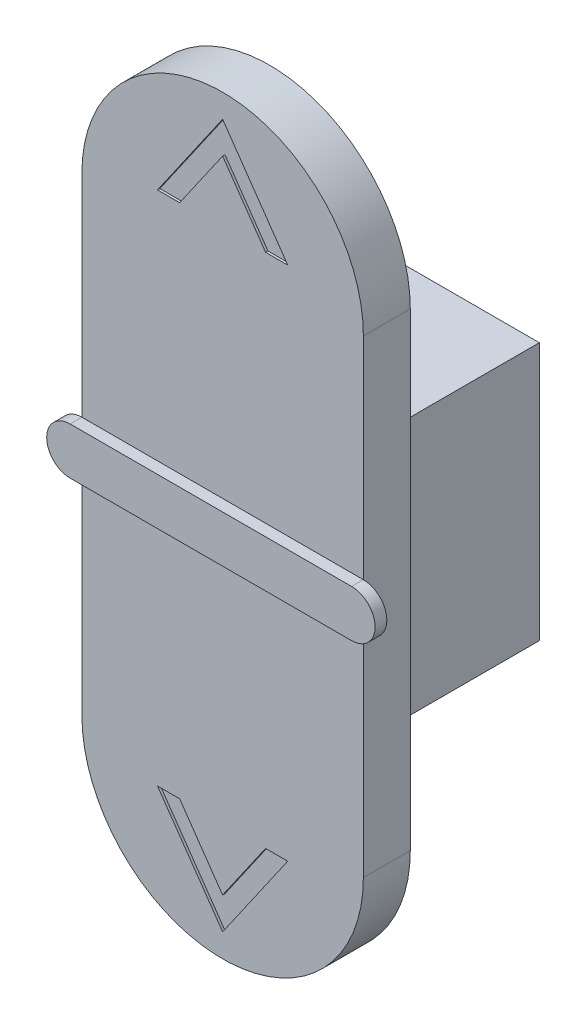
ISO-10303-21;
HEADER;
FILE_DESCRIPTION(('STEP AP214'),'2;1');
FILE_NAME('part.step','',(''),(''),'','','');
FILE_SCHEMA(('AUTOMOTIVE_DESIGN { 1 0 10303 214 1 1 1 1 }'));
ENDSEC;
DATA;
#1=APPLICATION_CONTEXT('core data for automotive mechanical design processes');
#2=APPLICATION_PROTOCOL_DEFINITION('international standard','automotive_design',2000,#1);
#3=PRODUCT_CONTEXT('',#1,'mechanical');
#4=PRODUCT('Part','Part','',(#3));
#5=PRODUCT_RELATED_PRODUCT_CATEGORY('part','',(#4));
#6=PRODUCT_DEFINITION_FORMATION('','',#4);
#7=PRODUCT_DEFINITION_CONTEXT('part definition',#1,'design');
#8=PRODUCT_DEFINITION('design','',#6,#7);
#9=PRODUCT_DEFINITION_SHAPE('','',#8);
#10=(LENGTH_UNIT() NAMED_UNIT(*) SI_UNIT(.MILLI.,.METRE.));
#11=(NAMED_UNIT(*) PLANE_ANGLE_UNIT() SI_UNIT($,.RADIAN.));
#12=(NAMED_UNIT(*) SI_UNIT($,.STERADIAN.) SOLID_ANGLE_UNIT());
#13=UNCERTAINTY_MEASURE_WITH_UNIT(LENGTH_MEASURE(1.E-05),#10,'distance_accuracy_value','');
#14=(GEOMETRIC_REPRESENTATION_CONTEXT(3) GLOBAL_UNCERTAINTY_ASSIGNED_CONTEXT((#13)) GLOBAL_UNIT_ASSIGNED_CONTEXT((#10,
#11,#12)) REPRESENTATION_CONTEXT('',''));
#15=CARTESIAN_POINT('',(0.,0.,0.));
#16=DIRECTION('',(0.,0.,1.));
#17=DIRECTION('',(1.,0.,0.));
#18=AXIS2_PLACEMENT_3D('',#15,#16,#17);
#19=CARTESIAN_POINT('',(0.,10.,0.));
#20=DIRECTION('',(0.,0.,1.));
#21=DIRECTION('',(1.,0.,0.));
#22=AXIS2_PLACEMENT_3D('',#19,#20,#21);
#23=PLANE('',#22);
#24=CARTESIAN_POINT('',(0.,10.,0.));
#25=DIRECTION('',(0.,0.,1.));
#26=DIRECTION('',(1.,0.,0.));
#27=AXIS2_PLACEMENT_3D('',#24,#25,#26);
#28=CIRCLE('',#27,6.);
#29=CARTESIAN_POINT('',(6.,10.,0.));
#30=VERTEX_POINT('',#29);
#31=CARTESIAN_POINT('',(-6.00000000000001,10.,0.));
#32=VERTEX_POINT('',#31);
#33=EDGE_CURVE('E518',#30,#32,#28,.T.);
#34=ORIENTED_EDGE('',*,*,#33,.F.);
#35=DIRECTION('',(0.,1.,0.));
#36=VECTOR('',#35,1.);
#37=CARTESIAN_POINT('',(6.,10.,0.));
#38=LINE('',#37,#36);
#39=CARTESIAN_POINT('',(6.,-10.,0.));
#40=VERTEX_POINT('',#39);
#41=EDGE_CURVE('E524',#40,#30,#38,.T.);
#42=ORIENTED_EDGE('',*,*,#41,.F.);
#43=CARTESIAN_POINT('',(0.,-10.,0.));
#44=DIRECTION('',(0.,0.,1.));
#45=DIRECTION('',(1.,0.,0.));
#46=AXIS2_PLACEMENT_3D('',#43,#44,#45);
#47=CIRCLE('',#46,6.);
#48=CARTESIAN_POINT('',(-6.,-10.,0.));
#49=VERTEX_POINT('',#48);
#50=EDGE_CURVE('E545',#49,#40,#47,.T.);
#51=ORIENTED_EDGE('',*,*,#50,.F.);
#52=DIRECTION('',(0.,-1.,0.));
#53=VECTOR('',#52,1.);
#54=CARTESIAN_POINT('',(-6.00000000000001,10.,0.));
#55=LINE('',#54,#53);
#56=EDGE_CURVE('E542',#32,#49,#55,.T.);
#57=ORIENTED_EDGE('',*,*,#56,.F.);
#58=EDGE_LOOP('',(#34,#42,#51,#57));
#59=FACE_BOUND('',#58,.T.);
#60=DIRECTION('',(0.,1.,0.));
#61=VECTOR('',#60,1.);
#62=CARTESIAN_POINT('',(-5.5,0.,0.));
#63=LINE('',#62,#61);
#64=CARTESIAN_POINT('',(-5.5,-5.5,0.));
#65=VERTEX_POINT('',#64);
#66=CARTESIAN_POINT('',(-5.5,5.5,0.));
#67=VERTEX_POINT('',#66);
#68=EDGE_CURVE('E268',#65,#67,#63,.T.);
#69=ORIENTED_EDGE('',*,*,#68,.F.);
#70=DIRECTION('',(-1.,0.,0.));
#71=VECTOR('',#70,1.);
#72=CARTESIAN_POINT('',(0.,-5.5,0.));
#73=LINE('',#72,#71);
#74=CARTESIAN_POINT('',(5.5,-5.5,0.));
#75=VERTEX_POINT('',#74);
#76=EDGE_CURVE('E307',#75,#65,#73,.T.);
#77=ORIENTED_EDGE('',*,*,#76,.F.);
#78=DIRECTION('',(0.,-1.,0.));
#79=VECTOR('',#78,1.);
#80=CARTESIAN_POINT('',(5.5,0.,0.));
#81=LINE('',#80,#79);
#82=CARTESIAN_POINT('',(5.5,5.5,0.));
#83=VERTEX_POINT('',#82);
#84=EDGE_CURVE('E84',#83,#75,#81,.T.);
#85=ORIENTED_EDGE('',*,*,#84,.F.);
#86=DIRECTION('',(1.,0.,0.));
#87=VECTOR('',#86,1.);
#88=CARTESIAN_POINT('',(0.,5.5,0.));
#89=LINE('',#88,#87);
#90=EDGE_CURVE('E79',#67,#83,#89,.T.);
#91=ORIENTED_EDGE('',*,*,#90,.F.);
#92=EDGE_LOOP('',(#69,#77,#85,#91));
#93=FACE_BOUND('',#92,.T.);
#94=ADVANCED_FACE('F63',(#59,#93),#23,.F.);
#95=CARTESIAN_POINT('',(0.,10.,2.));
#96=DIRECTION('',(0.,0.,1.));
#97=DIRECTION('',(1.,0.,0.));
#98=AXIS2_PLACEMENT_3D('',#95,#96,#97);
#99=PLANE('',#98);
#100=DIRECTION('',(-0.570395809495344,0.821369965673296,0.));
#101=VECTOR('',#100,1.);
#102=CARTESIAN_POINT('',(0.,15.,2.));
#103=LINE('',#102,#101);
#104=CARTESIAN_POINT('',(2.77560933298638,11.0031225604996,2.));
#105=VERTEX_POINT('',#104);
#106=CARTESIAN_POINT('',(0.,15.,2.));
#107=VERTEX_POINT('',#106);
#108=EDGE_CURVE('E368',#105,#107,#103,.T.);
#109=ORIENTED_EDGE('',*,*,#108,.F.);
#110=DIRECTION('',(1.,0.,0.));
#111=VECTOR('',#110,1.);
#112=CARTESIAN_POINT('',(2.77560933298638,11.0031225604996,2.));
#113=LINE('',#112,#111);
#114=CARTESIAN_POINT('',(1.83190215977101,11.0031225604996,2.));
#115=VERTEX_POINT('',#114);
#116=EDGE_CURVE('E347',#115,#105,#113,.T.);
#117=ORIENTED_EDGE('',*,*,#116,.F.);
#118=DIRECTION('',(0.570395809495344,-0.821369965673296,0.));
#119=VECTOR('',#118,1.);
#120=CARTESIAN_POINT('',(1.83190215977101,11.0031225604996,2.));
#121=LINE('',#120,#119);
#122=CARTESIAN_POINT('',(0.,13.6410616705699,2.));
#123=VERTEX_POINT('',#122);
#124=EDGE_CURVE('E384',#123,#115,#121,.T.);
#125=ORIENTED_EDGE('',*,*,#124,.F.);
#126=DIRECTION('',(0.570395809495344,0.821369965673296,0.));
#127=VECTOR('',#126,1.);
#128=CARTESIAN_POINT('',(-1.83190215977101,11.0031225604996,2.));
#129=LINE('',#128,#127);
#130=CARTESIAN_POINT('',(-1.83190215977101,11.0031225604996,2.));
#131=VERTEX_POINT('',#130);
#132=EDGE_CURVE('E380',#131,#123,#129,.T.);
#133=ORIENTED_EDGE('',*,*,#132,.F.);
#134=DIRECTION('',(1.,0.,0.));
#135=VECTOR('',#134,1.);
#136=CARTESIAN_POINT('',(-2.77560933298638,11.0031225604996,2.));
#137=LINE('',#136,#135);
#138=CARTESIAN_POINT('',(-2.77560933298638,11.0031225604996,2.));
#139=VERTEX_POINT('',#138);
#140=EDGE_CURVE('E376',#139,#131,#137,.T.);
#141=ORIENTED_EDGE('',*,*,#140,.F.);
#142=DIRECTION('',(-0.570395809495344,-0.821369965673296,0.));
#143=VECTOR('',#142,1.);
#144=CARTESIAN_POINT('',(0.,15.,2.));
#145=LINE('',#144,#143);
#146=EDGE_CURVE('E371',#107,#139,#145,.T.);
#147=ORIENTED_EDGE('',*,*,#146,.F.);
#148=EDGE_LOOP('',(#109,#117,#125,#133,#141,#147));
#149=FACE_BOUND('',#148,.T.);
#150=DIRECTION('',(-1.,0.,0.));
#151=VECTOR('',#150,1.);
#152=CARTESIAN_POINT('',(-6.,1.,2.));
#153=LINE('',#152,#151);
#154=CARTESIAN_POINT('',(6.,1.,2.));
#155=VERTEX_POINT('',#154);
#156=CARTESIAN_POINT('',(-6.,1.,2.));
#157=VERTEX_POINT('',#156);
#158=EDGE_CURVE('E479',#155,#157,#153,.T.);
#159=ORIENTED_EDGE('',*,*,#158,.F.);
#160=DIRECTION('',(0.,1.,0.));
#161=VECTOR('',#160,1.);
#162=CARTESIAN_POINT('',(6.,10.,2.));
#163=LINE('',#162,#161);
#164=CARTESIAN_POINT('',(6.,10.,2.));
#165=VERTEX_POINT('',#164);
#166=EDGE_CURVE('E533',#155,#165,#163,.T.);
#167=ORIENTED_EDGE('',*,*,#166,.T.);
#168=CARTESIAN_POINT('',(0.,10.,2.));
#169=DIRECTION('',(0.,0.,1.));
#170=DIRECTION('',(1.,0.,0.));
#171=AXIS2_PLACEMENT_3D('',#168,#169,#170);
#172=CIRCLE('',#171,6.);
#173=CARTESIAN_POINT('',(-6.00000000000001,10.,2.));
#174=VERTEX_POINT('',#173);
#175=EDGE_CURVE('E519',#165,#174,#172,.T.);
#176=ORIENTED_EDGE('',*,*,#175,.T.);
#177=DIRECTION('',(0.,-1.,0.));
#178=VECTOR('',#177,1.);
#179=CARTESIAN_POINT('',(-6.00000000000001,10.,2.));
#180=LINE('',#179,#178);
#181=EDGE_CURVE('E525',#174,#157,#180,.T.);
#182=ORIENTED_EDGE('',*,*,#181,.T.);
#183=EDGE_LOOP('',(#159,#167,#176,#182));
#184=FACE_BOUND('',#183,.T.);
#185=ADVANCED_FACE('F578',(#149,#184),#99,.T.);
#186=CARTESIAN_POINT('',(0.,10.,2.));
#187=DIRECTION('',(0.,0.,-1.));
#188=DIRECTION('',(-1.,0.,0.));
#189=AXIS2_PLACEMENT_3D('',#186,#187,#188);
#190=CYLINDRICAL_SURFACE('',#189,6.);
#191=ORIENTED_EDGE('',*,*,#33,.T.);
#192=DIRECTION('',(0.,0.,-1.));
#193=VECTOR('',#192,1.);
#194=CARTESIAN_POINT('',(-6.00000000000001,10.,2.));
#195=LINE('',#194,#193);
#196=EDGE_CURVE('E12',#174,#32,#195,.T.);
#197=ORIENTED_EDGE('',*,*,#196,.F.);
#198=ORIENTED_EDGE('',*,*,#175,.F.);
#199=DIRECTION('',(0.,0.,-1.));
#200=VECTOR('',#199,1.);
#201=CARTESIAN_POINT('',(6.,10.,2.));
#202=LINE('',#201,#200);
#203=EDGE_CURVE('E537',#165,#30,#202,.T.);
#204=ORIENTED_EDGE('',*,*,#203,.T.);
#205=EDGE_LOOP('',(#191,#197,#198,#204));
#206=FACE_BOUND('',#205,.T.);
#207=ADVANCED_FACE('F65',(#206),#190,.T.);
#208=CARTESIAN_POINT('',(-6.00000000000001,10.,2.));
#209=DIRECTION('',(1.,0.,0.));
#210=DIRECTION('',(0.,1.,0.));
#211=AXIS2_PLACEMENT_3D('',#208,#209,#210);
#212=PLANE('',#211);
#213=ORIENTED_EDGE('',*,*,#56,.T.);
#214=DIRECTION('',(0.,0.,-1.));
#215=VECTOR('',#214,1.);
#216=CARTESIAN_POINT('',(-6.,-10.,2.));
#217=LINE('',#216,#215);
#218=CARTESIAN_POINT('',(-6.,-10.,2.));
#219=VERTEX_POINT('',#218);
#220=EDGE_CURVE('E72',#219,#49,#217,.T.);
#221=ORIENTED_EDGE('',*,*,#220,.F.);
#222=CARTESIAN_POINT('',(-6.,-0.999999999999999,2.));
#223=VERTEX_POINT('',#222);
#224=EDGE_CURVE('E523',#223,#219,#180,.T.);
#225=ORIENTED_EDGE('',*,*,#224,.F.);
#226=EDGE_CURVE('E530',#157,#223,#180,.T.);
#227=ORIENTED_EDGE('',*,*,#226,.F.);
#228=ORIENTED_EDGE('',*,*,#181,.F.);
#229=ORIENTED_EDGE('',*,*,#196,.T.);
#230=EDGE_LOOP('',(#213,#221,#225,#227,#228,#229));
#231=FACE_BOUND('',#230,.T.);
#232=ADVANCED_FACE('F604',(#231),#212,.F.);
#233=CARTESIAN_POINT('',(0.,-10.,2.));
#234=DIRECTION('',(0.,0.,-1.));
#235=DIRECTION('',(-1.,0.,0.));
#236=AXIS2_PLACEMENT_3D('',#233,#234,#235);
#237=CYLINDRICAL_SURFACE('',#236,6.);
#238=ORIENTED_EDGE('',*,*,#50,.T.);
#239=DIRECTION('',(0.,0.,-1.));
#240=VECTOR('',#239,1.);
#241=CARTESIAN_POINT('',(6.,-10.,2.));
#242=LINE('',#241,#240);
#243=CARTESIAN_POINT('',(6.,-10.,2.));
#244=VERTEX_POINT('',#243);
#245=EDGE_CURVE('E553',#244,#40,#242,.T.);
#246=ORIENTED_EDGE('',*,*,#245,.F.);
#247=CARTESIAN_POINT('',(0.,-10.,2.));
#248=DIRECTION('',(0.,0.,1.));
#249=DIRECTION('',(1.,0.,0.));
#250=AXIS2_PLACEMENT_3D('',#247,#248,#249);
#251=CIRCLE('',#250,6.);
#252=EDGE_CURVE('E529',#219,#244,#251,.T.);
#253=ORIENTED_EDGE('',*,*,#252,.F.);
#254=ORIENTED_EDGE('',*,*,#220,.T.);
#255=EDGE_LOOP('',(#238,#246,#253,#254));
#256=FACE_BOUND('',#255,.T.);
#257=ADVANCED_FACE('F562',(#256),#237,.T.);
#258=CARTESIAN_POINT('',(6.,10.,2.));
#259=DIRECTION('',(-1.,0.,0.));
#260=DIRECTION('',(0.,-1.,0.));
#261=AXIS2_PLACEMENT_3D('',#258,#259,#260);
#262=PLANE('',#261);
#263=ORIENTED_EDGE('',*,*,#41,.T.);
#264=ORIENTED_EDGE('',*,*,#203,.F.);
#265=ORIENTED_EDGE('',*,*,#166,.F.);
#266=CARTESIAN_POINT('',(6.,-0.999999999999998,2.));
#267=VERTEX_POINT('',#266);
#268=EDGE_CURVE('E538',#267,#155,#163,.T.);
#269=ORIENTED_EDGE('',*,*,#268,.F.);
#270=EDGE_CURVE('E534',#244,#267,#163,.T.);
#271=ORIENTED_EDGE('',*,*,#270,.F.);
#272=ORIENTED_EDGE('',*,*,#245,.T.);
#273=EDGE_LOOP('',(#263,#264,#265,#269,#271,#272));
#274=FACE_BOUND('',#273,.T.);
#275=ADVANCED_FACE('F571',(#274),#262,.F.);
#276=DIRECTION('',(0.570395809495344,-0.821369965673296,0.));
#277=VECTOR('',#276,1.);
#278=CARTESIAN_POINT('',(0.,-15.,2.));
#279=LINE('',#278,#277);
#280=CARTESIAN_POINT('',(-2.77560933298638,-11.0031225604996,2.));
#281=VERTEX_POINT('',#280);
#282=CARTESIAN_POINT('',(0.,-15.,2.));
#283=VERTEX_POINT('',#282);
#284=EDGE_CURVE('E341',#281,#283,#279,.T.);
#285=ORIENTED_EDGE('',*,*,#284,.F.);
#286=DIRECTION('',(-1.,0.,0.));
#287=VECTOR('',#286,1.);
#288=CARTESIAN_POINT('',(-2.77560933298638,-11.0031225604996,2.));
#289=LINE('',#288,#287);
#290=CARTESIAN_POINT('',(-1.83190215977101,-11.0031225604996,2.));
#291=VERTEX_POINT('',#290);
#292=EDGE_CURVE('E415',#291,#281,#289,.T.);
#293=ORIENTED_EDGE('',*,*,#292,.F.);
#294=DIRECTION('',(-0.570395809495344,0.821369965673296,0.));
#295=VECTOR('',#294,1.);
#296=CARTESIAN_POINT('',(-1.83190215977101,-11.0031225604996,2.));
#297=LINE('',#296,#295);
#298=CARTESIAN_POINT('',(0.,-13.6410616705699,2.));
#299=VERTEX_POINT('',#298);
#300=EDGE_CURVE('E450',#299,#291,#297,.T.);
#301=ORIENTED_EDGE('',*,*,#300,.F.);
#302=DIRECTION('',(-0.570395809495344,-0.821369965673296,0.));
#303=VECTOR('',#302,1.);
#304=CARTESIAN_POINT('',(1.83190215977101,-11.0031225604996,2.));
#305=LINE('',#304,#303);
#306=CARTESIAN_POINT('',(1.83190215977101,-11.0031225604996,2.));
#307=VERTEX_POINT('',#306);
#308=EDGE_CURVE('E446',#307,#299,#305,.T.);
#309=ORIENTED_EDGE('',*,*,#308,.F.);
#310=DIRECTION('',(-1.,0.,0.));
#311=VECTOR('',#310,1.);
#312=CARTESIAN_POINT('',(2.77560933298638,-11.0031225604996,2.));
#313=LINE('',#312,#311);
#314=CARTESIAN_POINT('',(2.77560933298638,-11.0031225604996,2.));
#315=VERTEX_POINT('',#314);
#316=EDGE_CURVE('E442',#315,#307,#313,.T.);
#317=ORIENTED_EDGE('',*,*,#316,.F.);
#318=DIRECTION('',(0.570395809495344,0.821369965673296,0.));
#319=VECTOR('',#318,1.);
#320=CARTESIAN_POINT('',(0.,-15.,2.));
#321=LINE('',#320,#319);
#322=EDGE_CURVE('E438',#283,#315,#321,.T.);
#323=ORIENTED_EDGE('',*,*,#322,.F.);
#324=EDGE_LOOP('',(#285,#293,#301,#309,#317,#323));
#325=FACE_BOUND('',#324,.T.);
#326=DIRECTION('',(1.,0.,0.));
#327=VECTOR('',#326,1.);
#328=CARTESIAN_POINT('',(-6.,-1.,2.));
#329=LINE('',#328,#327);
#330=EDGE_CURVE('E492',#223,#267,#329,.T.);
#331=ORIENTED_EDGE('',*,*,#330,.F.);
#332=ORIENTED_EDGE('',*,*,#224,.T.);
#333=ORIENTED_EDGE('',*,*,#252,.T.);
#334=ORIENTED_EDGE('',*,*,#270,.T.);
#335=EDGE_LOOP('',(#331,#332,#333,#334));
#336=FACE_BOUND('',#335,.T.);
#337=ADVANCED_FACE('F602',(#325,#336),#99,.T.);
#338=CARTESIAN_POINT('',(-6.,0.,2.));
#339=DIRECTION('',(0.,0.,1.));
#340=DIRECTION('',(1.,0.,0.));
#341=AXIS2_PLACEMENT_3D('',#338,#339,#340);
#342=PLANE('',#341);
#343=CARTESIAN_POINT('',(-6.,0.,2.));
#344=DIRECTION('',(0.,0.,1.));
#345=DIRECTION('',(1.,0.,0.));
#346=AXIS2_PLACEMENT_3D('',#343,#344,#345);
#347=CIRCLE('',#346,1.);
#348=EDGE_CURVE('E394',#157,#223,#347,.T.);
#349=ORIENTED_EDGE('',*,*,#348,.F.);
#350=ORIENTED_EDGE('',*,*,#226,.T.);
#351=EDGE_LOOP('',(#349,#350));
#352=FACE_BOUND('',#351,.T.);
#353=ADVANCED_FACE('F608',(#352),#342,.F.);
#354=CARTESIAN_POINT('',(6.,0.,2.));
#355=DIRECTION('',(0.,0.,1.));
#356=DIRECTION('',(1.,0.,0.));
#357=AXIS2_PLACEMENT_3D('',#354,#355,#356);
#358=CIRCLE('',#357,1.);
#359=EDGE_CURVE('E496',#267,#155,#358,.T.);
#360=ORIENTED_EDGE('',*,*,#359,.F.);
#361=ORIENTED_EDGE('',*,*,#268,.T.);
#362=EDGE_LOOP('',(#360,#361));
#363=FACE_BOUND('',#362,.T.);
#364=ADVANCED_FACE('F585',(#363),#342,.F.);
#365=CARTESIAN_POINT('',(-6.,0.,2.5));
#366=DIRECTION('',(0.,0.,-1.));
#367=DIRECTION('',(-1.,0.,0.));
#368=AXIS2_PLACEMENT_3D('',#365,#366,#367);
#369=CYLINDRICAL_SURFACE('',#368,1.);
#370=ORIENTED_EDGE('',*,*,#348,.T.);
#371=DIRECTION('',(0.,0.,-1.));
#372=VECTOR('',#371,1.);
#373=CARTESIAN_POINT('',(-6.,-1.,2.5));
#374=LINE('',#373,#372);
#375=CARTESIAN_POINT('',(-6.,-1.,2.5));
#376=VERTEX_POINT('',#375);
#377=EDGE_CURVE('E514',#376,#223,#374,.T.);
#378=ORIENTED_EDGE('',*,*,#377,.F.);
#379=CARTESIAN_POINT('',(-6.,0.,2.5));
#380=DIRECTION('',(0.,0.,1.));
#381=DIRECTION('',(1.,0.,0.));
#382=AXIS2_PLACEMENT_3D('',#379,#380,#381);
#383=CIRCLE('',#382,1.);
#384=CARTESIAN_POINT('',(-6.,1.,2.5));
#385=VERTEX_POINT('',#384);
#386=EDGE_CURVE('E474',#385,#376,#383,.T.);
#387=ORIENTED_EDGE('',*,*,#386,.F.);
#388=DIRECTION('',(0.,0.,-1.));
#389=VECTOR('',#388,1.);
#390=CARTESIAN_POINT('',(-6.,1.,2.5));
#391=LINE('',#390,#389);
#392=EDGE_CURVE('E488',#385,#157,#391,.T.);
#393=ORIENTED_EDGE('',*,*,#392,.T.);
#394=EDGE_LOOP('',(#370,#378,#387,#393));
#395=FACE_BOUND('',#394,.T.);
#396=ADVANCED_FACE('F611',(#395),#369,.T.);
#397=CARTESIAN_POINT('',(-6.,-1.,2.5));
#398=DIRECTION('',(0.,1.,0.));
#399=DIRECTION('',(-1.,0.,0.));
#400=AXIS2_PLACEMENT_3D('',#397,#398,#399);
#401=PLANE('',#400);
#402=ORIENTED_EDGE('',*,*,#330,.T.);
#403=DIRECTION('',(0.,0.,-1.));
#404=VECTOR('',#403,1.);
#405=CARTESIAN_POINT('',(6.,-0.999999999999998,2.5));
#406=LINE('',#405,#404);
#407=CARTESIAN_POINT('',(6.,-0.999999999999998,2.5));
#408=VERTEX_POINT('',#407);
#409=EDGE_CURVE('E510',#408,#267,#406,.T.);
#410=ORIENTED_EDGE('',*,*,#409,.F.);
#411=DIRECTION('',(1.,0.,0.));
#412=VECTOR('',#411,1.);
#413=CARTESIAN_POINT('',(-6.,-1.,2.5));
#414=LINE('',#413,#412);
#415=EDGE_CURVE('E478',#376,#408,#414,.T.);
#416=ORIENTED_EDGE('',*,*,#415,.F.);
#417=ORIENTED_EDGE('',*,*,#377,.T.);
#418=EDGE_LOOP('',(#402,#410,#416,#417));
#419=FACE_BOUND('',#418,.T.);
#420=ADVANCED_FACE('F600',(#419),#401,.F.);
#421=CARTESIAN_POINT('',(6.,0.,2.5));
#422=DIRECTION('',(0.,0.,-1.));
#423=DIRECTION('',(-1.,0.,0.));
#424=AXIS2_PLACEMENT_3D('',#421,#422,#423);
#425=CYLINDRICAL_SURFACE('',#424,1.);
#426=ORIENTED_EDGE('',*,*,#359,.T.);
#427=DIRECTION('',(0.,0.,-1.));
#428=VECTOR('',#427,1.);
#429=CARTESIAN_POINT('',(6.,1.,2.5));
#430=LINE('',#429,#428);
#431=CARTESIAN_POINT('',(6.,1.,2.5));
#432=VERTEX_POINT('',#431);
#433=EDGE_CURVE('E506',#432,#155,#430,.T.);
#434=ORIENTED_EDGE('',*,*,#433,.F.);
#435=CARTESIAN_POINT('',(6.,0.,2.5));
#436=DIRECTION('',(0.,0.,1.));
#437=DIRECTION('',(1.,0.,0.));
#438=AXIS2_PLACEMENT_3D('',#435,#436,#437);
#439=CIRCLE('',#438,1.);
#440=EDGE_CURVE('E482',#408,#432,#439,.T.);
#441=ORIENTED_EDGE('',*,*,#440,.F.);
#442=ORIENTED_EDGE('',*,*,#409,.T.);
#443=EDGE_LOOP('',(#426,#434,#441,#442));
#444=FACE_BOUND('',#443,.T.);
#445=ADVANCED_FACE('F588',(#444),#425,.T.);
#446=CARTESIAN_POINT('',(-6.,1.,2.5));
#447=DIRECTION('',(0.,-1.,0.));
#448=DIRECTION('',(1.,0.,0.));
#449=AXIS2_PLACEMENT_3D('',#446,#447,#448);
#450=PLANE('',#449);
#451=ORIENTED_EDGE('',*,*,#158,.T.);
#452=ORIENTED_EDGE('',*,*,#392,.F.);
#453=DIRECTION('',(-1.,0.,0.));
#454=VECTOR('',#453,1.);
#455=CARTESIAN_POINT('',(-6.,1.,2.5));
#456=LINE('',#455,#454);
#457=EDGE_CURVE('E485',#432,#385,#456,.T.);
#458=ORIENTED_EDGE('',*,*,#457,.F.);
#459=ORIENTED_EDGE('',*,*,#433,.T.);
#460=EDGE_LOOP('',(#451,#452,#458,#459));
#461=FACE_BOUND('',#460,.T.);
#462=ADVANCED_FACE('F593',(#461),#450,.F.);
#463=CARTESIAN_POINT('',(-6.,0.,2.5));
#464=DIRECTION('',(0.,0.,1.));
#465=DIRECTION('',(1.,0.,0.));
#466=AXIS2_PLACEMENT_3D('',#463,#464,#465);
#467=PLANE('',#466);
#468=ORIENTED_EDGE('',*,*,#386,.T.);
#469=ORIENTED_EDGE('',*,*,#415,.T.);
#470=ORIENTED_EDGE('',*,*,#440,.T.);
#471=ORIENTED_EDGE('',*,*,#457,.T.);
#472=EDGE_LOOP('',(#468,#469,#470,#471));
#473=FACE_BOUND('',#472,.T.);
#474=ADVANCED_FACE('F597',(#473),#467,.T.);
#475=CARTESIAN_POINT('',(0.,-15.,1.9));
#476=DIRECTION('',(-0.821369965673296,-0.570395809495344,0.));
#477=DIRECTION('',(0.570395809495344,-0.821369965673296,0.));
#478=AXIS2_PLACEMENT_3D('',#475,#476,#477);
#479=PLANE('',#478);
#480=ORIENTED_EDGE('',*,*,#284,.T.);
#481=DIRECTION('',(0.,0.,1.));
#482=VECTOR('',#481,1.);
#483=CARTESIAN_POINT('',(0.,-15.,1.9));
#484=LINE('',#483,#482);
#485=CARTESIAN_POINT('',(0.,-15.,1.9));
#486=VERTEX_POINT('',#485);
#487=EDGE_CURVE('E435',#486,#283,#484,.T.);
#488=ORIENTED_EDGE('',*,*,#487,.F.);
#489=DIRECTION('',(0.570395809495344,-0.821369965673296,0.));
#490=VECTOR('',#489,1.);
#491=CARTESIAN_POINT('',(0.,-15.,1.9));
#492=LINE('',#491,#490);
#493=CARTESIAN_POINT('',(-2.77560933298638,-11.0031225604996,1.9));
#494=VERTEX_POINT('',#493);
#495=EDGE_CURVE('E410',#494,#486,#492,.T.);
#496=ORIENTED_EDGE('',*,*,#495,.F.);
#497=DIRECTION('',(0.,0.,1.));
#498=VECTOR('',#497,1.);
#499=CARTESIAN_POINT('',(-2.77560933298638,-11.0031225604996,1.9));
#500=LINE('',#499,#498);
#501=EDGE_CURVE('E372',#494,#281,#500,.T.);
#502=ORIENTED_EDGE('',*,*,#501,.T.);
#503=EDGE_LOOP('',(#480,#488,#496,#502));
#504=FACE_BOUND('',#503,.T.);
#505=ADVANCED_FACE('F706',(#504),#479,.F.);
#506=CARTESIAN_POINT('',(-2.77560933298638,-11.0031225604996,1.9));
#507=DIRECTION('',(0.,1.,0.));
#508=DIRECTION('',(0.,0.,1.));
#509=AXIS2_PLACEMENT_3D('',#506,#507,#508);
#510=PLANE('',#509);
#511=ORIENTED_EDGE('',*,*,#292,.T.);
#512=ORIENTED_EDGE('',*,*,#501,.F.);
#513=DIRECTION('',(-1.,0.,0.));
#514=VECTOR('',#513,1.);
#515=CARTESIAN_POINT('',(-2.77560933298638,-11.0031225604996,1.9));
#516=LINE('',#515,#514);
#517=CARTESIAN_POINT('',(-1.83190215977101,-11.0031225604996,1.9));
#518=VERTEX_POINT('',#517);
#519=EDGE_CURVE('E431',#518,#494,#516,.T.);
#520=ORIENTED_EDGE('',*,*,#519,.F.);
#521=DIRECTION('',(0.,0.,1.));
#522=VECTOR('',#521,1.);
#523=CARTESIAN_POINT('',(-1.83190215977101,-11.0031225604996,1.9));
#524=LINE('',#523,#522);
#525=EDGE_CURVE('E459',#518,#291,#524,.T.);
#526=ORIENTED_EDGE('',*,*,#525,.T.);
#527=EDGE_LOOP('',(#511,#512,#520,#526));
#528=FACE_BOUND('',#527,.T.);
#529=ADVANCED_FACE('F702',(#528),#510,.F.);
#530=CARTESIAN_POINT('',(-1.83190215977101,-11.0031225604996,1.9));
#531=DIRECTION('',(0.821369965673296,0.570395809495344,0.));
#532=DIRECTION('',(-0.570395809495344,0.821369965673296,0.));
#533=AXIS2_PLACEMENT_3D('',#530,#531,#532);
#534=PLANE('',#533);
#535=ORIENTED_EDGE('',*,*,#300,.T.);
#536=ORIENTED_EDGE('',*,*,#525,.F.);
#537=DIRECTION('',(-0.570395809495344,0.821369965673296,0.));
#538=VECTOR('',#537,1.);
#539=CARTESIAN_POINT('',(-1.83190215977101,-11.0031225604996,1.9));
#540=LINE('',#539,#538);
#541=CARTESIAN_POINT('',(0.,-13.6410616705699,1.9));
#542=VERTEX_POINT('',#541);
#543=EDGE_CURVE('E427',#542,#518,#540,.T.);
#544=ORIENTED_EDGE('',*,*,#543,.F.);
#545=DIRECTION('',(0.,0.,1.));
#546=VECTOR('',#545,1.);
#547=CARTESIAN_POINT('',(0.,-13.6410616705699,1.9));
#548=LINE('',#547,#546);
#549=EDGE_CURVE('E462',#542,#299,#548,.T.);
#550=ORIENTED_EDGE('',*,*,#549,.T.);
#551=EDGE_LOOP('',(#535,#536,#544,#550));
#552=FACE_BOUND('',#551,.T.);
#553=ADVANCED_FACE('F705',(#552),#534,.F.);
#554=CARTESIAN_POINT('',(1.83190215977101,-11.0031225604996,1.9));
#555=DIRECTION('',(-0.821369965673296,0.570395809495344,0.));
#556=DIRECTION('',(-0.570395809495344,-0.821369965673296,0.));
#557=AXIS2_PLACEMENT_3D('',#554,#555,#556);
#558=PLANE('',#557);
#559=ORIENTED_EDGE('',*,*,#308,.T.);
#560=ORIENTED_EDGE('',*,*,#549,.F.);
#561=DIRECTION('',(-0.570395809495344,-0.821369965673296,0.));
#562=VECTOR('',#561,1.);
#563=CARTESIAN_POINT('',(1.83190215977101,-11.0031225604996,1.9));
#564=LINE('',#563,#562);
#565=CARTESIAN_POINT('',(1.83190215977101,-11.0031225604996,1.9));
#566=VERTEX_POINT('',#565);
#567=EDGE_CURVE('E423',#566,#542,#564,.T.);
#568=ORIENTED_EDGE('',*,*,#567,.F.);
#569=DIRECTION('',(0.,0.,1.));
#570=VECTOR('',#569,1.);
#571=CARTESIAN_POINT('',(1.83190215977101,-11.0031225604996,1.9));
#572=LINE('',#571,#570);
#573=EDGE_CURVE('E465',#566,#307,#572,.T.);
#574=ORIENTED_EDGE('',*,*,#573,.T.);
#575=EDGE_LOOP('',(#559,#560,#568,#574));
#576=FACE_BOUND('',#575,.T.);
#577=ADVANCED_FACE('F710',(#576),#558,.F.);
#578=CARTESIAN_POINT('',(2.77560933298638,-11.0031225604996,1.9));
#579=DIRECTION('',(0.,1.,0.));
#580=DIRECTION('',(0.,0.,1.));
#581=AXIS2_PLACEMENT_3D('',#578,#579,#580);
#582=PLANE('',#581);
#583=ORIENTED_EDGE('',*,*,#316,.T.);
#584=ORIENTED_EDGE('',*,*,#573,.F.);
#585=DIRECTION('',(-1.,0.,0.));
#586=VECTOR('',#585,1.);
#587=CARTESIAN_POINT('',(2.77560933298638,-11.0031225604996,1.9));
#588=LINE('',#587,#586);
#589=CARTESIAN_POINT('',(2.77560933298638,-11.0031225604996,1.9));
#590=VERTEX_POINT('',#589);
#591=EDGE_CURVE('E419',#590,#566,#588,.T.);
#592=ORIENTED_EDGE('',*,*,#591,.F.);
#593=DIRECTION('',(0.,0.,1.));
#594=VECTOR('',#593,1.);
#595=CARTESIAN_POINT('',(2.77560933298638,-11.0031225604996,1.9));
#596=LINE('',#595,#594);
#597=EDGE_CURVE('E468',#590,#315,#596,.T.);
#598=ORIENTED_EDGE('',*,*,#597,.T.);
#599=EDGE_LOOP('',(#583,#584,#592,#598));
#600=FACE_BOUND('',#599,.T.);
#601=ADVANCED_FACE('F714',(#600),#582,.F.);
#602=CARTESIAN_POINT('',(0.,-15.,1.9));
#603=DIRECTION('',(0.821369965673296,-0.570395809495344,0.));
#604=DIRECTION('',(0.570395809495344,0.821369965673296,0.));
#605=AXIS2_PLACEMENT_3D('',#602,#603,#604);
#606=PLANE('',#605);
#607=ORIENTED_EDGE('',*,*,#322,.T.);
#608=ORIENTED_EDGE('',*,*,#597,.F.);
#609=DIRECTION('',(0.570395809495344,0.821369965673296,0.));
#610=VECTOR('',#609,1.);
#611=CARTESIAN_POINT('',(0.,-15.,1.9));
#612=LINE('',#611,#610);
#613=EDGE_CURVE('E414',#486,#590,#612,.T.);
#614=ORIENTED_EDGE('',*,*,#613,.F.);
#615=ORIENTED_EDGE('',*,*,#487,.T.);
#616=EDGE_LOOP('',(#607,#608,#614,#615));
#617=FACE_BOUND('',#616,.T.);
#618=ADVANCED_FACE('F700',(#617),#606,.F.);
#619=CARTESIAN_POINT('',(0.,0.,1.9));
#620=DIRECTION('',(0.,0.,1.));
#621=DIRECTION('',(1.,0.,0.));
#622=AXIS2_PLACEMENT_3D('',#619,#620,#621);
#623=PLANE('',#622);
#624=ORIENTED_EDGE('',*,*,#495,.T.);
#625=ORIENTED_EDGE('',*,*,#613,.T.);
#626=ORIENTED_EDGE('',*,*,#591,.T.);
#627=ORIENTED_EDGE('',*,*,#567,.T.);
#628=ORIENTED_EDGE('',*,*,#543,.T.);
#629=ORIENTED_EDGE('',*,*,#519,.T.);
#630=EDGE_LOOP('',(#624,#625,#626,#627,#628,#629));
#631=FACE_BOUND('',#630,.T.);
#632=ADVANCED_FACE('F696',(#631),#623,.T.);
#633=CARTESIAN_POINT('',(0.,15.,1.9));
#634=DIRECTION('',(0.821369965673296,0.570395809495344,0.));
#635=DIRECTION('',(-0.570395809495344,0.821369965673296,0.));
#636=AXIS2_PLACEMENT_3D('',#633,#634,#635);
#637=PLANE('',#636);
#638=ORIENTED_EDGE('',*,*,#108,.T.);
#639=DIRECTION('',(0.,0.,1.));
#640=VECTOR('',#639,1.);
#641=CARTESIAN_POINT('',(0.,15.,1.9));
#642=LINE('',#641,#640);
#643=CARTESIAN_POINT('',(0.,15.,1.9));
#644=VERTEX_POINT('',#643);
#645=EDGE_CURVE('E367',#644,#107,#642,.T.);
#646=ORIENTED_EDGE('',*,*,#645,.F.);
#647=DIRECTION('',(-0.570395809495344,0.821369965673296,0.));
#648=VECTOR('',#647,1.);
#649=CARTESIAN_POINT('',(0.,15.,1.9));
#650=LINE('',#649,#648);
#651=CARTESIAN_POINT('',(2.77560933298638,11.0031225604996,1.9));
#652=VERTEX_POINT('',#651);
#653=EDGE_CURVE('E342',#652,#644,#650,.T.);
#654=ORIENTED_EDGE('',*,*,#653,.F.);
#655=DIRECTION('',(0.,0.,1.));
#656=VECTOR('',#655,1.);
#657=CARTESIAN_POINT('',(2.77560933298638,11.0031225604996,1.9));
#658=LINE('',#657,#656);
#659=EDGE_CURVE('E391',#652,#105,#658,.T.);
#660=ORIENTED_EDGE('',*,*,#659,.T.);
#661=EDGE_LOOP('',(#638,#646,#654,#660));
#662=FACE_BOUND('',#661,.T.);
#663=ADVANCED_FACE('F678',(#662),#637,.F.);
#664=CARTESIAN_POINT('',(2.77560933298638,11.0031225604996,1.9));
#665=DIRECTION('',(0.,-1.,0.));
#666=DIRECTION('',(0.,0.,-1.));
#667=AXIS2_PLACEMENT_3D('',#664,#665,#666);
#668=PLANE('',#667);
#669=ORIENTED_EDGE('',*,*,#116,.T.);
#670=ORIENTED_EDGE('',*,*,#659,.F.);
#671=DIRECTION('',(1.,0.,0.));
#672=VECTOR('',#671,1.);
#673=CARTESIAN_POINT('',(2.77560933298638,11.0031225604996,1.9));
#674=LINE('',#673,#672);
#675=CARTESIAN_POINT('',(1.83190215977101,11.0031225604996,1.9));
#676=VERTEX_POINT('',#675);
#677=EDGE_CURVE('E363',#676,#652,#674,.T.);
#678=ORIENTED_EDGE('',*,*,#677,.F.);
#679=DIRECTION('',(0.,0.,1.));
#680=VECTOR('',#679,1.);
#681=CARTESIAN_POINT('',(1.83190215977101,11.0031225604996,1.9));
#682=LINE('',#681,#680);
#683=EDGE_CURVE('E395',#676,#115,#682,.T.);
#684=ORIENTED_EDGE('',*,*,#683,.T.);
#685=EDGE_LOOP('',(#669,#670,#678,#684));
#686=FACE_BOUND('',#685,.T.);
#687=ADVANCED_FACE('F674',(#686),#668,.F.);
#688=CARTESIAN_POINT('',(1.83190215977101,11.0031225604996,1.9));
#689=DIRECTION('',(-0.821369965673296,-0.570395809495344,0.));
#690=DIRECTION('',(0.570395809495344,-0.821369965673296,0.));
#691=AXIS2_PLACEMENT_3D('',#688,#689,#690);
#692=PLANE('',#691);
#693=ORIENTED_EDGE('',*,*,#124,.T.);
#694=ORIENTED_EDGE('',*,*,#683,.F.);
#695=DIRECTION('',(0.570395809495344,-0.821369965673296,0.));
#696=VECTOR('',#695,1.);
#697=CARTESIAN_POINT('',(1.83190215977101,11.0031225604996,1.9));
#698=LINE('',#697,#696);
#699=CARTESIAN_POINT('',(0.,13.6410616705699,1.9));
#700=VERTEX_POINT('',#699);
#701=EDGE_CURVE('E359',#700,#676,#698,.T.);
#702=ORIENTED_EDGE('',*,*,#701,.F.);
#703=DIRECTION('',(0.,0.,1.));
#704=VECTOR('',#703,1.);
#705=CARTESIAN_POINT('',(0.,13.6410616705699,1.9));
#706=LINE('',#705,#704);
#707=EDGE_CURVE('E398',#700,#123,#706,.T.);
#708=ORIENTED_EDGE('',*,*,#707,.T.);
#709=EDGE_LOOP('',(#693,#694,#702,#708));
#710=FACE_BOUND('',#709,.T.);
#711=ADVANCED_FACE('F677',(#710),#692,.F.);
#712=CARTESIAN_POINT('',(-1.83190215977101,11.0031225604996,1.9));
#713=DIRECTION('',(0.821369965673296,-0.570395809495344,0.));
#714=DIRECTION('',(0.570395809495344,0.821369965673296,0.));
#715=AXIS2_PLACEMENT_3D('',#712,#713,#714);
#716=PLANE('',#715);
#717=ORIENTED_EDGE('',*,*,#132,.T.);
#718=ORIENTED_EDGE('',*,*,#707,.F.);
#719=DIRECTION('',(0.570395809495344,0.821369965673296,0.));
#720=VECTOR('',#719,1.);
#721=CARTESIAN_POINT('',(-1.83190215977101,11.0031225604996,1.9));
#722=LINE('',#721,#720);
#723=CARTESIAN_POINT('',(-1.83190215977101,11.0031225604996,1.9));
#724=VERTEX_POINT('',#723);
#725=EDGE_CURVE('E355',#724,#700,#722,.T.);
#726=ORIENTED_EDGE('',*,*,#725,.F.);
#727=DIRECTION('',(0.,0.,1.));
#728=VECTOR('',#727,1.);
#729=CARTESIAN_POINT('',(-1.83190215977101,11.0031225604996,1.9));
#730=LINE('',#729,#728);
#731=EDGE_CURVE('E401',#724,#131,#730,.T.);
#732=ORIENTED_EDGE('',*,*,#731,.T.);
#733=EDGE_LOOP('',(#717,#718,#726,#732));
#734=FACE_BOUND('',#733,.T.);
#735=ADVANCED_FACE('F682',(#734),#716,.F.);
#736=CARTESIAN_POINT('',(-2.77560933298638,11.0031225604996,1.9));
#737=DIRECTION('',(0.,-1.,0.));
#738=DIRECTION('',(0.,0.,-1.));
#739=AXIS2_PLACEMENT_3D('',#736,#737,#738);
#740=PLANE('',#739);
#741=ORIENTED_EDGE('',*,*,#140,.T.);
#742=ORIENTED_EDGE('',*,*,#731,.F.);
#743=DIRECTION('',(1.,0.,0.));
#744=VECTOR('',#743,1.);
#745=CARTESIAN_POINT('',(-2.77560933298638,11.0031225604996,1.9));
#746=LINE('',#745,#744);
#747=CARTESIAN_POINT('',(-2.77560933298638,11.0031225604996,1.9));
#748=VERTEX_POINT('',#747);
#749=EDGE_CURVE('E351',#748,#724,#746,.T.);
#750=ORIENTED_EDGE('',*,*,#749,.F.);
#751=DIRECTION('',(0.,0.,1.));
#752=VECTOR('',#751,1.);
#753=CARTESIAN_POINT('',(-2.77560933298638,11.0031225604996,1.9));
#754=LINE('',#753,#752);
#755=EDGE_CURVE('E404',#748,#139,#754,.T.);
#756=ORIENTED_EDGE('',*,*,#755,.T.);
#757=EDGE_LOOP('',(#741,#742,#750,#756));
#758=FACE_BOUND('',#757,.T.);
#759=ADVANCED_FACE('F686',(#758),#740,.F.);
#760=CARTESIAN_POINT('',(0.,15.,1.9));
#761=DIRECTION('',(-0.821369965673296,0.570395809495344,0.));
#762=DIRECTION('',(-0.570395809495344,-0.821369965673296,0.));
#763=AXIS2_PLACEMENT_3D('',#760,#761,#762);
#764=PLANE('',#763);
#765=ORIENTED_EDGE('',*,*,#146,.T.);
#766=ORIENTED_EDGE('',*,*,#755,.F.);
#767=DIRECTION('',(-0.570395809495344,-0.821369965673296,0.));
#768=VECTOR('',#767,1.);
#769=CARTESIAN_POINT('',(0.,15.,1.9));
#770=LINE('',#769,#768);
#771=EDGE_CURVE('E346',#644,#748,#770,.T.);
#772=ORIENTED_EDGE('',*,*,#771,.F.);
#773=ORIENTED_EDGE('',*,*,#645,.T.);
#774=EDGE_LOOP('',(#765,#766,#772,#773));
#775=FACE_BOUND('',#774,.T.);
#776=ADVANCED_FACE('F672',(#775),#764,.F.);
#777=CARTESIAN_POINT('',(0.,0.,1.9));
#778=DIRECTION('',(0.,0.,1.));
#779=DIRECTION('',(1.,0.,0.));
#780=AXIS2_PLACEMENT_3D('',#777,#778,#779);
#781=PLANE('',#780);
#782=ORIENTED_EDGE('',*,*,#653,.T.);
#783=ORIENTED_EDGE('',*,*,#771,.T.);
#784=ORIENTED_EDGE('',*,*,#749,.T.);
#785=ORIENTED_EDGE('',*,*,#725,.T.);
#786=ORIENTED_EDGE('',*,*,#701,.T.);
#787=ORIENTED_EDGE('',*,*,#677,.T.);
#788=EDGE_LOOP('',(#782,#783,#784,#785,#786,#787));
#789=FACE_BOUND('',#788,.T.);
#790=ADVANCED_FACE('F654',(#789),#781,.T.);
#791=CARTESIAN_POINT('',(0.,0.,-6.));
#792=DIRECTION('',(0.,0.,-1.));
#793=DIRECTION('',(-1.,0.,0.));
#794=AXIS2_PLACEMENT_3D('',#791,#792,#793);
#795=PLANE('',#794);
#796=DIRECTION('',(0.,1.,0.));
#797=VECTOR('',#796,1.);
#798=CARTESIAN_POINT('',(-5.5,0.,-6.));
#799=LINE('',#798,#797);
#800=CARTESIAN_POINT('',(-5.5,-5.5,-6.));
#801=VERTEX_POINT('',#800);
#802=CARTESIAN_POINT('',(-5.5,5.5,-6.));
#803=VERTEX_POINT('',#802);
#804=EDGE_CURVE('E302',#801,#803,#799,.T.);
#805=ORIENTED_EDGE('',*,*,#804,.T.);
#806=DIRECTION('',(1.,0.,0.));
#807=VECTOR('',#806,1.);
#808=CARTESIAN_POINT('',(0.,5.5,-6.));
#809=LINE('',#808,#807);
#810=CARTESIAN_POINT('',(5.5,5.5,-6.));
#811=VERTEX_POINT('',#810);
#812=EDGE_CURVE('E306',#803,#811,#809,.T.);
#813=ORIENTED_EDGE('',*,*,#812,.T.);
#814=DIRECTION('',(0.,-1.,0.));
#815=VECTOR('',#814,1.);
#816=CARTESIAN_POINT('',(5.5,0.,-6.));
#817=LINE('',#816,#815);
#818=CARTESIAN_POINT('',(5.5,-5.5,-6.));
#819=VERTEX_POINT('',#818);
#820=EDGE_CURVE('E310',#811,#819,#817,.T.);
#821=ORIENTED_EDGE('',*,*,#820,.T.);
#822=DIRECTION('',(-1.,0.,0.));
#823=VECTOR('',#822,1.);
#824=CARTESIAN_POINT('',(0.,-5.5,-6.));
#825=LINE('',#824,#823);
#826=EDGE_CURVE('E313',#819,#801,#825,.T.);
#827=ORIENTED_EDGE('',*,*,#826,.T.);
#828=EDGE_LOOP('',(#805,#813,#821,#827));
#829=FACE_BOUND('',#828,.T.);
#830=DIRECTION('',(1.,0.,0.));
#831=VECTOR('',#830,1.);
#832=CARTESIAN_POINT('',(4.5,4.5,-6.));
#833=LINE('',#832,#831);
#834=CARTESIAN_POINT('',(-4.5,4.5,-6.));
#835=VERTEX_POINT('',#834);
#836=CARTESIAN_POINT('',(4.5,4.5,-6.));
#837=VERTEX_POINT('',#836);
#838=EDGE_CURVE('E259',#835,#837,#833,.T.);
#839=ORIENTED_EDGE('',*,*,#838,.F.);
#840=DIRECTION('',(0.,1.,0.));
#841=VECTOR('',#840,1.);
#842=CARTESIAN_POINT('',(-4.5,-4.5,-6.));
#843=LINE('',#842,#841);
#844=CARTESIAN_POINT('',(-4.5,-4.5,-6.));
#845=VERTEX_POINT('',#844);
#846=EDGE_CURVE('E248',#845,#835,#843,.T.);
#847=ORIENTED_EDGE('',*,*,#846,.F.);
#848=DIRECTION('',(-1.,0.,0.));
#849=VECTOR('',#848,1.);
#850=CARTESIAN_POINT('',(4.5,-4.5,-6.));
#851=LINE('',#850,#849);
#852=CARTESIAN_POINT('',(4.5,-4.5,-6.));
#853=VERTEX_POINT('',#852);
#854=EDGE_CURVE('E278',#853,#845,#851,.T.);
#855=ORIENTED_EDGE('',*,*,#854,.F.);
#856=DIRECTION('',(0.,-1.,0.));
#857=VECTOR('',#856,1.);
#858=CARTESIAN_POINT('',(4.5,-4.5,-6.));
#859=LINE('',#858,#857);
#860=EDGE_CURVE('E274',#837,#853,#859,.T.);
#861=ORIENTED_EDGE('',*,*,#860,.F.);
#862=EDGE_LOOP('',(#839,#847,#855,#861));
#863=FACE_BOUND('',#862,.T.);
#864=ADVANCED_FACE('F272',(#829,#863),#795,.T.);
#865=CARTESIAN_POINT('',(-5.5,0.,-6.));
#866=DIRECTION('',(1.,0.,0.));
#867=DIRECTION('',(0.,0.,-1.));
#868=AXIS2_PLACEMENT_3D('',#865,#866,#867);
#869=PLANE('',#868);
#870=ORIENTED_EDGE('',*,*,#68,.T.);
#871=DIRECTION('',(0.,0.,1.));
#872=VECTOR('',#871,1.);
#873=CARTESIAN_POINT('',(-5.5,5.5,-6.));
#874=LINE('',#873,#872);
#875=EDGE_CURVE('E338',#803,#67,#874,.T.);
#876=ORIENTED_EDGE('',*,*,#875,.F.);
#877=ORIENTED_EDGE('',*,*,#804,.F.);
#878=DIRECTION('',(0.,0.,1.));
#879=VECTOR('',#878,1.);
#880=CARTESIAN_POINT('',(-5.5,-5.5,-6.));
#881=LINE('',#880,#879);
#882=EDGE_CURVE('E316',#801,#65,#881,.T.);
#883=ORIENTED_EDGE('',*,*,#882,.T.);
#884=EDGE_LOOP('',(#870,#876,#877,#883));
#885=FACE_BOUND('',#884,.T.);
#886=ADVANCED_FACE('F653',(#885),#869,.F.);
#887=CARTESIAN_POINT('',(0.,5.5,-6.));
#888=DIRECTION('',(0.,-1.,0.));
#889=DIRECTION('',(0.,0.,-1.));
#890=AXIS2_PLACEMENT_3D('',#887,#888,#889);
#891=PLANE('',#890);
#892=ORIENTED_EDGE('',*,*,#90,.T.);
#893=DIRECTION('',(0.,0.,1.));
#894=VECTOR('',#893,1.);
#895=CARTESIAN_POINT('',(5.5,5.5,-6.));
#896=LINE('',#895,#894);
#897=EDGE_CURVE('E334',#811,#83,#896,.T.);
#898=ORIENTED_EDGE('',*,*,#897,.F.);
#899=ORIENTED_EDGE('',*,*,#812,.F.);
#900=ORIENTED_EDGE('',*,*,#875,.T.);
#901=EDGE_LOOP('',(#892,#898,#899,#900));
#902=FACE_BOUND('',#901,.T.);
#903=ADVANCED_FACE('F662',(#902),#891,.F.);
#904=CARTESIAN_POINT('',(5.5,0.,-6.));
#905=DIRECTION('',(-1.,0.,0.));
#906=DIRECTION('',(0.,0.,1.));
#907=AXIS2_PLACEMENT_3D('',#904,#905,#906);
#908=PLANE('',#907);
#909=ORIENTED_EDGE('',*,*,#84,.T.);
#910=DIRECTION('',(0.,0.,1.));
#911=VECTOR('',#910,1.);
#912=CARTESIAN_POINT('',(5.5,-5.5,-6.));
#913=LINE('',#912,#911);
#914=EDGE_CURVE('E330',#819,#75,#913,.T.);
#915=ORIENTED_EDGE('',*,*,#914,.F.);
#916=ORIENTED_EDGE('',*,*,#820,.F.);
#917=ORIENTED_EDGE('',*,*,#897,.T.);
#918=EDGE_LOOP('',(#909,#915,#916,#917));
#919=FACE_BOUND('',#918,.T.);
#920=ADVANCED_FACE('F658',(#919),#908,.F.);
#921=CARTESIAN_POINT('',(0.,-5.5,-6.));
#922=DIRECTION('',(0.,1.,0.));
#923=DIRECTION('',(0.,0.,1.));
#924=AXIS2_PLACEMENT_3D('',#921,#922,#923);
#925=PLANE('',#924);
#926=ORIENTED_EDGE('',*,*,#76,.T.);
#927=ORIENTED_EDGE('',*,*,#882,.F.);
#928=ORIENTED_EDGE('',*,*,#826,.F.);
#929=ORIENTED_EDGE('',*,*,#914,.T.);
#930=EDGE_LOOP('',(#926,#927,#928,#929));
#931=FACE_BOUND('',#930,.T.);
#932=ADVANCED_FACE('F650',(#931),#925,.F.);
#933=CARTESIAN_POINT('',(-4.5,-4.5,-6.));
#934=DIRECTION('',(1.,0.,0.));
#935=DIRECTION('',(0.,0.,-1.));
#936=AXIS2_PLACEMENT_3D('',#933,#934,#935);
#937=PLANE('',#936);
#938=DIRECTION('',(0.,1.,0.));
#939=VECTOR('',#938,1.);
#940=CARTESIAN_POINT('',(-4.5,-4.5,0.));
#941=LINE('',#940,#939);
#942=CARTESIAN_POINT('',(-4.5,-4.5,0.));
#943=VERTEX_POINT('',#942);
#944=CARTESIAN_POINT('',(-4.5,4.5,0.));
#945=VERTEX_POINT('',#944);
#946=EDGE_CURVE('E283',#943,#945,#941,.T.);
#947=ORIENTED_EDGE('',*,*,#946,.F.);
#948=DIRECTION('',(0.,0.,1.));
#949=VECTOR('',#948,1.);
#950=CARTESIAN_POINT('',(-4.5,-4.5,-6.));
#951=LINE('',#950,#949);
#952=EDGE_CURVE('E254',#845,#943,#951,.T.);
#953=ORIENTED_EDGE('',*,*,#952,.F.);
#954=ORIENTED_EDGE('',*,*,#846,.T.);
#955=DIRECTION('',(0.,0.,1.));
#956=VECTOR('',#955,1.);
#957=CARTESIAN_POINT('',(-4.5,4.5,-6.));
#958=LINE('',#957,#956);
#959=EDGE_CURVE('E252',#835,#945,#958,.T.);
#960=ORIENTED_EDGE('',*,*,#959,.T.);
#961=EDGE_LOOP('',(#947,#953,#954,#960));
#962=FACE_BOUND('',#961,.T.);
#963=ADVANCED_FACE('F251',(#962),#937,.T.);
#964=CARTESIAN_POINT('',(4.5,4.5,-6.));
#965=DIRECTION('',(0.,-1.,0.));
#966=DIRECTION('',(0.,0.,-1.));
#967=AXIS2_PLACEMENT_3D('',#964,#965,#966);
#968=PLANE('',#967);
#969=DIRECTION('',(1.,0.,0.));
#970=VECTOR('',#969,1.);
#971=CARTESIAN_POINT('',(4.5,4.5,0.));
#972=LINE('',#971,#970);
#973=CARTESIAN_POINT('',(4.5,4.5,0.));
#974=VERTEX_POINT('',#973);
#975=EDGE_CURVE('E266',#945,#974,#972,.T.);
#976=ORIENTED_EDGE('',*,*,#975,.F.);
#977=ORIENTED_EDGE('',*,*,#959,.F.);
#978=ORIENTED_EDGE('',*,*,#838,.T.);
#979=DIRECTION('',(0.,0.,1.));
#980=VECTOR('',#979,1.);
#981=CARTESIAN_POINT('',(4.5,4.5,-6.));
#982=LINE('',#981,#980);
#983=EDGE_CURVE('E269',#837,#974,#982,.T.);
#984=ORIENTED_EDGE('',*,*,#983,.T.);
#985=EDGE_LOOP('',(#976,#977,#978,#984));
#986=FACE_BOUND('',#985,.T.);
#987=ADVANCED_FACE('F263',(#986),#968,.T.);
#988=CARTESIAN_POINT('',(4.5,-4.5,-6.));
#989=DIRECTION('',(-1.,0.,0.));
#990=DIRECTION('',(0.,0.,1.));
#991=AXIS2_PLACEMENT_3D('',#988,#989,#990);
#992=PLANE('',#991);
#993=DIRECTION('',(0.,-1.,0.));
#994=VECTOR('',#993,1.);
#995=CARTESIAN_POINT('',(4.5,-4.5,0.));
#996=LINE('',#995,#994);
#997=CARTESIAN_POINT('',(4.5,-4.5,0.));
#998=VERTEX_POINT('',#997);
#999=EDGE_CURVE('E288',#974,#998,#996,.T.);
#1000=ORIENTED_EDGE('',*,*,#999,.F.);
#1001=ORIENTED_EDGE('',*,*,#983,.F.);
#1002=ORIENTED_EDGE('',*,*,#860,.T.);
#1003=DIRECTION('',(0.,0.,1.));
#1004=VECTOR('',#1003,1.);
#1005=CARTESIAN_POINT('',(4.5,-4.5,-6.));
#1006=LINE('',#1005,#1004);
#1007=EDGE_CURVE('E297',#853,#998,#1006,.T.);
#1008=ORIENTED_EDGE('',*,*,#1007,.T.);
#1009=EDGE_LOOP('',(#1000,#1001,#1002,#1008));
#1010=FACE_BOUND('',#1009,.T.);
#1011=ADVANCED_FACE('F635',(#1010),#992,.T.);
#1012=CARTESIAN_POINT('',(4.5,-4.5,-6.));
#1013=DIRECTION('',(0.,1.,0.));
#1014=DIRECTION('',(0.,0.,1.));
#1015=AXIS2_PLACEMENT_3D('',#1012,#1013,#1014);
#1016=PLANE('',#1015);
#1017=DIRECTION('',(-1.,0.,0.));
#1018=VECTOR('',#1017,1.);
#1019=CARTESIAN_POINT('',(4.5,-4.5,0.));
#1020=LINE('',#1019,#1018);
#1021=EDGE_CURVE('E260',#998,#943,#1020,.T.);
#1022=ORIENTED_EDGE('',*,*,#1021,.F.);
#1023=ORIENTED_EDGE('',*,*,#1007,.F.);
#1024=ORIENTED_EDGE('',*,*,#854,.T.);
#1025=ORIENTED_EDGE('',*,*,#952,.T.);
#1026=EDGE_LOOP('',(#1022,#1023,#1024,#1025));
#1027=FACE_BOUND('',#1026,.T.);
#1028=ADVANCED_FACE('F630',(#1027),#1016,.T.);
#1029=ORIENTED_EDGE('',*,*,#1021,.T.);
#1030=ORIENTED_EDGE('',*,*,#946,.T.);
#1031=ORIENTED_EDGE('',*,*,#975,.T.);
#1032=ORIENTED_EDGE('',*,*,#999,.T.);
#1033=EDGE_LOOP('',(#1029,#1030,#1031,#1032));
#1034=FACE_BOUND('',#1033,.T.);
#1035=ADVANCED_FACE('F623',(#1034),#23,.F.);
#1036=CLOSED_SHELL('',(#94,#185,#207,#232,#257,#275,#337,#353,#364,#396,#420,#445,#462,#474,
#505,#529,#553,#577,#601,#618,#632,#663,#687,#711,#735,#759,#776,#790,#864,#886,#903,#920,#932,
#963,#987,#1011,#1028,#1035));
#1037=MANIFOLD_SOLID_BREP('B2',#1036);
#1038=ADVANCED_BREP_SHAPE_REPRESENTATION('',(#18,#1037),#14);
#1039=SHAPE_DEFINITION_REPRESENTATION(#9,#1038);
ENDSEC;
END-ISO-10303-21;
